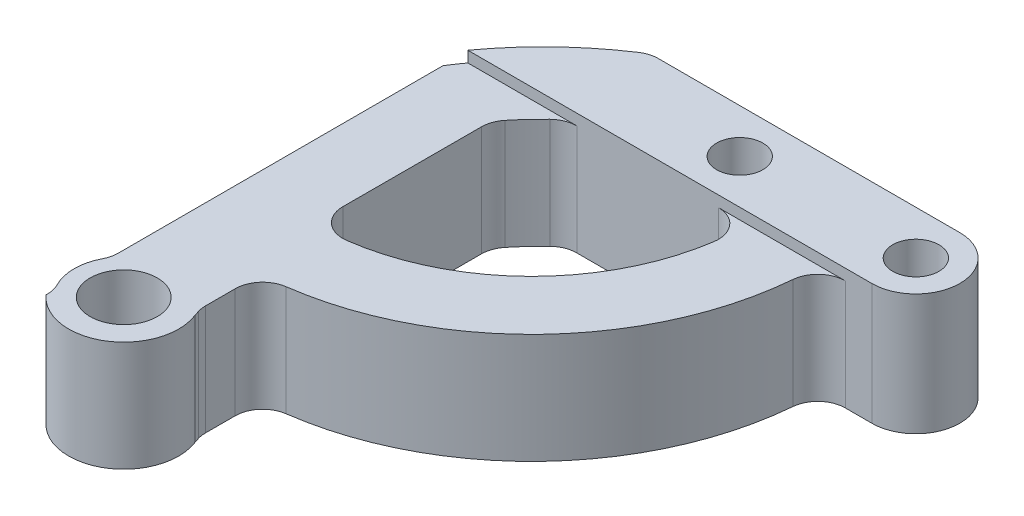
ISO-10303-21;
HEADER;
FILE_DESCRIPTION(('STEP AP214'),'2;1');
FILE_NAME('part.step','',(''),(''),'','','');
FILE_SCHEMA(('AUTOMOTIVE_DESIGN { 1 0 10303 214 1 1 1 1 }'));
ENDSEC;
DATA;
#1=APPLICATION_CONTEXT('core data for automotive mechanical design processes');
#2=APPLICATION_PROTOCOL_DEFINITION('international standard','automotive_design',2000,#1);
#3=PRODUCT_CONTEXT('',#1,'mechanical');
#4=PRODUCT('Part','Part','',(#3));
#5=PRODUCT_RELATED_PRODUCT_CATEGORY('part','',(#4));
#6=PRODUCT_DEFINITION_FORMATION('','',#4);
#7=PRODUCT_DEFINITION_CONTEXT('part definition',#1,'design');
#8=PRODUCT_DEFINITION('design','',#6,#7);
#9=PRODUCT_DEFINITION_SHAPE('','',#8);
#10=(LENGTH_UNIT() NAMED_UNIT(*) SI_UNIT(.MILLI.,.METRE.));
#11=(NAMED_UNIT(*) PLANE_ANGLE_UNIT() SI_UNIT($,.RADIAN.));
#12=(NAMED_UNIT(*) SI_UNIT($,.STERADIAN.) SOLID_ANGLE_UNIT());
#13=UNCERTAINTY_MEASURE_WITH_UNIT(LENGTH_MEASURE(1.E-05),#10,'distance_accuracy_value','');
#14=(GEOMETRIC_REPRESENTATION_CONTEXT(3) GLOBAL_UNCERTAINTY_ASSIGNED_CONTEXT((#13)) GLOBAL_UNIT_ASSIGNED_CONTEXT((#10,
#11,#12)) REPRESENTATION_CONTEXT('',''));
#15=CARTESIAN_POINT('',(0.,0.,0.));
#16=DIRECTION('',(0.,0.,1.));
#17=DIRECTION('',(1.,0.,0.));
#18=AXIS2_PLACEMENT_3D('',#15,#16,#17);
#19=CARTESIAN_POINT('',(-137.900057304547,11.,45.0701696846439));
#20=DIRECTION('',(0.,1.,0.));
#21=DIRECTION('',(0.,0.,1.));
#22=AXIS2_PLACEMENT_3D('',#19,#20,#21);
#23=PLANE('',#22);
#24=DIRECTION('',(-1.,0.,0.));
#25=VECTOR('',#24,1.);
#26=CARTESIAN_POINT('',(-115.253720533932,11.,10.999999988027));
#27=LINE('',#26,#25);
#28=CARTESIAN_POINT('',(-103.99999853308,11.,11.0000022761214));
#29=VERTEX_POINT('',#28);
#30=CARTESIAN_POINT('',(-140.702512300106,11.,11.0000022761214));
#31=VERTEX_POINT('',#30);
#32=EDGE_CURVE('E212',#29,#31,#27,.T.);
#33=ORIENTED_EDGE('',*,*,#32,.F.);
#34=CARTESIAN_POINT('',(-103.99999853308,11.,7.00000227612142));
#35=DIRECTION('',(0.,1.,0.));
#36=DIRECTION('',(0.,0.,1.));
#37=AXIS2_PLACEMENT_3D('',#34,#35,#36);
#38=CIRCLE('',#37,4.);
#39=CARTESIAN_POINT('',(-103.99999853308,11.,3.00000227612141));
#40=VERTEX_POINT('',#39);
#41=EDGE_CURVE('E246',#29,#40,#38,.T.);
#42=ORIENTED_EDGE('',*,*,#41,.T.);
#43=DIRECTION('',(-1.,0.,0.));
#44=VECTOR('',#43,1.);
#45=CARTESIAN_POINT('',(-103.99999853308,11.,3.00000227612141));
#46=LINE('',#45,#44);
#47=CARTESIAN_POINT('',(-131.402508646967,11.,3.00000227612142));
#48=VERTEX_POINT('',#47);
#49=EDGE_CURVE('E242',#40,#48,#46,.T.);
#50=ORIENTED_EDGE('',*,*,#49,.T.);
#51=CARTESIAN_POINT('',(-131.402508646967,11.,5.50000227612142));
#52=DIRECTION('',(0.,1.,0.));
#53=DIRECTION('',(0.,0.,1.));
#54=AXIS2_PLACEMENT_3D('',#51,#52,#53);
#55=CIRCLE('',#54,2.5);
#56=CARTESIAN_POINT('',(-132.779604595994,11.,3.41347244236101));
#57=VERTEX_POINT('',#56);
#58=EDGE_CURVE('E240',#48,#57,#55,.T.);
#59=ORIENTED_EDGE('',*,*,#58,.T.);
#60=CARTESIAN_POINT('',(-115.936153617783,11.,28.9341073656856));
#61=DIRECTION('',(0.,1.,0.));
#62=DIRECTION('',(0.,0.,1.));
#63=AXIS2_PLACEMENT_3D('',#60,#61,#62);
#64=CIRCLE('',#63,30.5778457015044);
#65=EDGE_CURVE('E231',#57,#31,#64,.T.);
#66=ORIENTED_EDGE('',*,*,#65,.T.);
#67=EDGE_LOOP('',(#33,#42,#50,#59,#66));
#68=FACE_BOUND('',#67,.T.);
#69=CARTESIAN_POINT('',(-120.,11.,7.));
#70=DIRECTION('',(0.,1.,0.));
#71=DIRECTION('',(0.,0.,1.));
#72=AXIS2_PLACEMENT_3D('',#69,#70,#71);
#73=CIRCLE('',#72,2.1);
#74=CARTESIAN_POINT('',(-120.,11.,9.1));
#75=VERTEX_POINT('',#74);
#76=EDGE_CURVE('E254',#75,#75,#73,.T.);
#77=ORIENTED_EDGE('',*,*,#76,.F.);
#78=EDGE_LOOP('',(#77));
#79=FACE_BOUND('',#78,.T.);
#80=CARTESIAN_POINT('',(-103.99999853308,11.,7.00000227612142));
#81=DIRECTION('',(0.,1.,0.));
#82=DIRECTION('',(0.,0.,1.));
#83=AXIS2_PLACEMENT_3D('',#80,#81,#82);
#84=CIRCLE('',#83,2.1);
#85=CARTESIAN_POINT('',(-103.99999853308,11.,9.10000227612142));
#86=VERTEX_POINT('',#85);
#87=EDGE_CURVE('E431',#86,#86,#84,.T.);
#88=ORIENTED_EDGE('',*,*,#87,.F.);
#89=EDGE_LOOP('',(#88));
#90=FACE_BOUND('',#89,.T.);
#91=ADVANCED_FACE('F33',(#68,#79,#90),#23,.T.);
#92=CARTESIAN_POINT('',(-137.900057304547,0.,45.0701696846439));
#93=DIRECTION('',(0.,1.,0.));
#94=DIRECTION('',(0.,0.,1.));
#95=AXIS2_PLACEMENT_3D('',#92,#93,#94);
#96=PLANE('',#95);
#97=CARTESIAN_POINT('',(-137.900057304547,0.,45.0701696846439));
#98=DIRECTION('',(0.,1.,0.));
#99=DIRECTION('',(0.,0.,1.));
#100=AXIS2_PLACEMENT_3D('',#97,#98,#99);
#101=CIRCLE('',#100,3.04999999999999);
#102=CARTESIAN_POINT('',(-137.900057304547,0.,48.1201696846439));
#103=VERTEX_POINT('',#102);
#104=EDGE_CURVE('E223',#103,#103,#101,.T.);
#105=ORIENTED_EDGE('',*,*,#104,.T.);
#106=EDGE_LOOP('',(#105));
#107=FACE_BOUND('',#106,.T.);
#108=CARTESIAN_POINT('',(-120.,0.,7.));
#109=DIRECTION('',(0.,1.,0.));
#110=DIRECTION('',(0.,0.,1.));
#111=AXIS2_PLACEMENT_3D('',#108,#109,#110);
#112=CIRCLE('',#111,2.1);
#113=CARTESIAN_POINT('',(-120.,0.,9.1));
#114=VERTEX_POINT('',#113);
#115=EDGE_CURVE('E449',#114,#114,#112,.T.);
#116=ORIENTED_EDGE('',*,*,#115,.T.);
#117=EDGE_LOOP('',(#116));
#118=FACE_BOUND('',#117,.T.);
#119=CARTESIAN_POINT('',(-115.936153617783,0.,28.9341073656856));
#120=DIRECTION('',(0.,1.,0.));
#121=DIRECTION('',(0.,0.,1.));
#122=AXIS2_PLACEMENT_3D('',#119,#120,#121);
#123=CIRCLE('',#122,30.5778457015044);
#124=CARTESIAN_POINT('',(-132.779604595994,0.,3.41347244236101));
#125=VERTEX_POINT('',#124);
#126=CARTESIAN_POINT('',(-141.61803314586,0.,12.3375501428647));
#127=VERTEX_POINT('',#126);
#128=EDGE_CURVE('E275',#125,#127,#123,.T.);
#129=ORIENTED_EDGE('',*,*,#128,.F.);
#130=CARTESIAN_POINT('',(-131.402508646967,0.,5.50000227612142));
#131=DIRECTION('',(0.,1.,0.));
#132=DIRECTION('',(0.,0.,1.));
#133=AXIS2_PLACEMENT_3D('',#130,#131,#132);
#134=CIRCLE('',#133,2.5);
#135=CARTESIAN_POINT('',(-131.402508646967,0.,3.00000227612142));
#136=VERTEX_POINT('',#135);
#137=EDGE_CURVE('E308',#125,#136,#134,.F.);
#138=ORIENTED_EDGE('',*,*,#137,.T.);
#139=DIRECTION('',(-1.,0.,0.));
#140=VECTOR('',#139,1.);
#141=CARTESIAN_POINT('',(-103.99999853308,0.,3.00000227612141));
#142=LINE('',#141,#140);
#143=CARTESIAN_POINT('',(-103.99999853308,0.,3.00000227612141));
#144=VERTEX_POINT('',#143);
#145=EDGE_CURVE('E273',#144,#136,#142,.T.);
#146=ORIENTED_EDGE('',*,*,#145,.F.);
#147=CARTESIAN_POINT('',(-103.99999853308,0.,7.00000227612142));
#148=DIRECTION('',(0.,1.,0.));
#149=DIRECTION('',(0.,0.,1.));
#150=AXIS2_PLACEMENT_3D('',#147,#148,#149);
#151=CIRCLE('',#150,4.);
#152=CARTESIAN_POINT('',(-103.99999853308,0.,11.0000022761214));
#153=VERTEX_POINT('',#152);
#154=EDGE_CURVE('E271',#153,#144,#151,.T.);
#155=ORIENTED_EDGE('',*,*,#154,.F.);
#156=DIRECTION('',(1.,0.,0.));
#157=VECTOR('',#156,1.);
#158=CARTESIAN_POINT('',(-103.99999853308,0.,11.0000022761214));
#159=LINE('',#158,#157);
#160=CARTESIAN_POINT('',(-106.409907587343,0.,11.0000022761214));
#161=VERTEX_POINT('',#160);
#162=EDGE_CURVE('E269',#161,#153,#159,.T.);
#163=ORIENTED_EDGE('',*,*,#162,.F.);
#164=CARTESIAN_POINT('',(-106.409907587343,0.,13.5000022761214));
#165=DIRECTION('',(0.,1.,0.));
#166=DIRECTION('',(0.,0.,1.));
#167=AXIS2_PLACEMENT_3D('',#164,#165,#166);
#168=CIRCLE('',#167,2.5);
#169=CARTESIAN_POINT('',(-108.900341189247,0.,13.2815063390666));
#170=VERTEX_POINT('',#169);
#171=EDGE_CURVE('E348',#161,#170,#168,.T.);
#172=ORIENTED_EDGE('',*,*,#171,.T.);
#173=CARTESIAN_POINT('',(-134.905127164563,0.,10.999999988027));
#174=DIRECTION('',(0.,1.,0.));
#175=DIRECTION('',(0.,0.,1.));
#176=AXIS2_PLACEMENT_3D('',#173,#174,#175);
#177=CIRCLE('',#176,26.1046770685219);
#178=CARTESIAN_POINT('',(-131.347838312971,0.,36.8611650986354));
#179=VERTEX_POINT('',#178);
#180=EDGE_CURVE('E266',#179,#170,#177,.T.);
#181=ORIENTED_EDGE('',*,*,#180,.F.);
#182=CARTESIAN_POINT('',(-131.007162881299,0.,39.3378443774794));
#183=DIRECTION('',(0.,1.,0.));
#184=DIRECTION('',(0.,0.,1.));
#185=AXIS2_PLACEMENT_3D('',#182,#183,#184);
#186=CIRCLE('',#185,2.5);
#187=CARTESIAN_POINT('',(-133.507162881299,0.,39.3378443774794));
#188=VERTEX_POINT('',#187);
#189=EDGE_CURVE('E358',#179,#188,#186,.T.);
#190=ORIENTED_EDGE('',*,*,#189,.T.);
#191=DIRECTION('',(0.,0.,-1.));
#192=VECTOR('',#191,1.);
#193=CARTESIAN_POINT('',(-133.507162881299,0.,42.4282503088));
#194=LINE('',#193,#192);
#195=CARTESIAN_POINT('',(-133.507162881299,0.,42.038769083608));
#196=VERTEX_POINT('',#195);
#197=EDGE_CURVE('E263',#196,#188,#194,.T.);
#198=ORIENTED_EDGE('',*,*,#197,.F.);
#199=CARTESIAN_POINT('',(-131.007162881299,0.,42.038769083608));
#200=DIRECTION('',(0.,1.,0.));
#201=DIRECTION('',(0.,0.,1.));
#202=AXIS2_PLACEMENT_3D('',#199,#200,#201);
#203=CIRCLE('',#202,2.5);
#204=CARTESIAN_POINT('',(-133.38760812801,0.,42.8026279890429));
#205=VERTEX_POINT('',#204);
#206=EDGE_CURVE('E346',#196,#205,#203,.T.);
#207=ORIENTED_EDGE('',*,*,#206,.T.);
#208=CARTESIAN_POINT('',(0.,0.,0.));
#209=DIRECTION('',(0.,-1.,0.));
#210=DIRECTION('',(0.,0.,1.));
#211=AXIS2_PLACEMENT_3D('',#208,#209,#210);
#212=CIRCLE('',#211,140.086826521554);
#213=CARTESIAN_POINT('',(-133.264424689396,0.,43.1846277867973));
#214=VERTEX_POINT('',#213);
#215=EDGE_CURVE('E260',#214,#205,#212,.T.);
#216=ORIENTED_EDGE('',*,*,#215,.F.);
#217=CARTESIAN_POINT('',(-130.886177783558,0.,42.413951684356));
#218=DIRECTION('',(0.,1.,0.));
#219=DIRECTION('',(0.,0.,1.));
#220=AXIS2_PLACEMENT_3D('',#217,#218,#219);
#221=CIRCLE('',#220,2.5);
#222=CARTESIAN_POINT('',(-133.224137623888,0.,43.2993576844519));
#223=VERTEX_POINT('',#222);
#224=EDGE_CURVE('E344',#214,#223,#221,.T.);
#225=ORIENTED_EDGE('',*,*,#224,.T.);
#226=CARTESIAN_POINT('',(-137.900057304547,0.,45.0701696846439));
#227=DIRECTION('',(0.,1.,0.));
#228=DIRECTION('',(0.,0.,1.));
#229=AXIS2_PLACEMENT_3D('',#226,#227,#228);
#230=CIRCLE('',#229,5.00000000000012);
#231=CARTESIAN_POINT('',(-141.61803314586,0.,48.4133202411424));
#232=VERTEX_POINT('',#231);
#233=EDGE_CURVE('E257',#232,#223,#230,.T.);
#234=ORIENTED_EDGE('',*,*,#233,.F.);
#235=DIRECTION('',(0.,0.,1.));
#236=VECTOR('',#235,1.);
#237=CARTESIAN_POINT('',(-141.61803314586,0.,48.4133202411424));
#238=LINE('',#237,#236);
#239=CARTESIAN_POINT('',(-141.61803314586,0.,48.2852554435082));
#240=VERTEX_POINT('',#239);
#241=EDGE_CURVE('E253',#240,#232,#238,.T.);
#242=ORIENTED_EDGE('',*,*,#241,.F.);
#243=CARTESIAN_POINT('',(-144.11803314586,0.,48.2852554435082));
#244=DIRECTION('',(0.,1.,0.));
#245=DIRECTION('',(0.,0.,1.));
#246=AXIS2_PLACEMENT_3D('',#243,#244,#245);
#247=CIRCLE('',#246,2.5);
#248=CARTESIAN_POINT('',(-141.897327488248,0.,47.1370105296281));
#249=VERTEX_POINT('',#248);
#250=EDGE_CURVE('E342',#240,#249,#247,.T.);
#251=ORIENTED_EDGE('',*,*,#250,.T.);
#252=CARTESIAN_POINT('',(-137.900057304547,0.,45.0701696846439));
#253=DIRECTION('',(0.,1.,0.));
#254=DIRECTION('',(0.,0.,1.));
#255=AXIS2_PLACEMENT_3D('',#252,#253,#254);
#256=CIRCLE('',#255,4.49999999999999);
#257=CARTESIAN_POINT('',(-141.897327488248,0.,43.0033288396597));
#258=VERTEX_POINT('',#257);
#259=EDGE_CURVE('E250',#258,#249,#256,.T.);
#260=ORIENTED_EDGE('',*,*,#259,.F.);
#261=CARTESIAN_POINT('',(-144.11803314586,0.,41.8550839257796));
#262=DIRECTION('',(0.,1.,0.));
#263=DIRECTION('',(0.,0.,1.));
#264=AXIS2_PLACEMENT_3D('',#261,#262,#263);
#265=CIRCLE('',#264,2.5);
#266=CARTESIAN_POINT('',(-141.61803314586,0.,41.8550839257796));
#267=VERTEX_POINT('',#266);
#268=EDGE_CURVE('E41',#258,#267,#265,.T.);
#269=ORIENTED_EDGE('',*,*,#268,.T.);
#270=DIRECTION('',(0.,0.,1.));
#271=VECTOR('',#270,1.);
#272=CARTESIAN_POINT('',(-141.61803314586,0.,42.5350847465372));
#273=LINE('',#272,#271);
#274=EDGE_CURVE('E278',#127,#267,#273,.T.);
#275=ORIENTED_EDGE('',*,*,#274,.F.);
#276=EDGE_LOOP('',(#129,#138,#146,#155,#163,#172,#181,#190,#198,#207,#216,#225,#234,#242,#251,
#260,#269,#275));
#277=FACE_BOUND('',#276,.T.);
#278=DIRECTION('',(-0.00107779575862326,0.,0.999999419177983));
#279=VECTOR('',#278,1.);
#280=CARTESIAN_POINT('',(-135.059388527963,0.,14.5432040979085));
#281=LINE('',#280,#279);
#282=CARTESIAN_POINT('',(-135.060315226767,0.,15.4030128872954));
#283=VERTEX_POINT('',#282);
#284=CARTESIAN_POINT('',(-135.073880940624,0.,27.9895404082243));
#285=VERTEX_POINT('',#284);
#286=EDGE_CURVE('E224',#283,#285,#281,.T.);
#287=ORIENTED_EDGE('',*,*,#286,.T.);
#288=CARTESIAN_POINT('',(-132.57388239268,0.,27.9922348976209));
#289=DIRECTION('',(0.,1.,0.));
#290=DIRECTION('',(0.,0.,1.));
#291=AXIS2_PLACEMENT_3D('',#288,#289,#290);
#292=CIRCLE('',#291,2.5);
#293=CARTESIAN_POINT('',(-132.234078663736,0.,30.4690339257611));
#294=VERTEX_POINT('',#293);
#295=EDGE_CURVE('E352',#285,#294,#292,.T.);
#296=ORIENTED_EDGE('',*,*,#295,.T.);
#297=CARTESIAN_POINT('',(-134.905127164563,0.,10.999999988027));
#298=DIRECTION('',(0.,1.,0.));
#299=DIRECTION('',(0.,0.,1.));
#300=AXIS2_PLACEMENT_3D('',#297,#298,#299);
#301=CIRCLE('',#300,19.6514066306311);
#302=CARTESIAN_POINT('',(-115.463599805775,0.,13.8644015869511));
#303=VERTEX_POINT('',#302);
#304=EDGE_CURVE('E434',#294,#303,#301,.T.);
#305=ORIENTED_EDGE('',*,*,#304,.T.);
#306=CARTESIAN_POINT('',(-117.93689951966,0.,13.499999988027));
#307=DIRECTION('',(0.,1.,0.));
#308=DIRECTION('',(0.,0.,1.));
#309=AXIS2_PLACEMENT_3D('',#306,#307,#308);
#310=CIRCLE('',#309,2.5);
#311=CARTESIAN_POINT('',(-117.93689951966,0.,10.999999988027));
#312=VERTEX_POINT('',#311);
#313=EDGE_CURVE('E354',#303,#312,#310,.T.);
#314=ORIENTED_EDGE('',*,*,#313,.T.);
#315=DIRECTION('',(-1.,0.,0.));
#316=VECTOR('',#315,1.);
#317=CARTESIAN_POINT('',(-115.253720533932,0.,10.999999988027));
#318=LINE('',#317,#316);
#319=CARTESIAN_POINT('',(-130.807896393838,0.,10.999999988027));
#320=VERTEX_POINT('',#319);
#321=EDGE_CURVE('E439',#312,#320,#318,.T.);
#322=ORIENTED_EDGE('',*,*,#321,.T.);
#323=CARTESIAN_POINT('',(-130.807896393838,0.,13.499999988027));
#324=DIRECTION('',(0.,1.,0.));
#325=DIRECTION('',(0.,0.,1.));
#326=AXIS2_PLACEMENT_3D('',#323,#324,#325);
#327=CIRCLE('',#326,2.5);
#328=CARTESIAN_POINT('',(-132.542561495374,0.,11.6997397330887));
#329=VERTEX_POINT('',#328);
#330=EDGE_CURVE('E356',#320,#329,#327,.T.);
#331=ORIENTED_EDGE('',*,*,#330,.T.);
#332=CARTESIAN_POINT('',(-115.936153617783,0.,28.9341073656856));
#333=DIRECTION('',(0.,1.,0.));
#334=DIRECTION('',(0.,0.,1.));
#335=AXIS2_PLACEMENT_3D('',#332,#333,#334);
#336=CIRCLE('',#335,23.9331613100406);
#337=CARTESIAN_POINT('',(-134.499387031133,0.,13.8277320382318));
#338=VERTEX_POINT('',#337);
#339=EDGE_CURVE('E442',#329,#338,#336,.T.);
#340=ORIENTED_EDGE('',*,*,#339,.T.);
#341=CARTESIAN_POINT('',(-132.560316678822,0.,15.405707376692));
#342=DIRECTION('',(0.,1.,0.));
#343=DIRECTION('',(0.,0.,1.));
#344=AXIS2_PLACEMENT_3D('',#341,#342,#343);
#345=CIRCLE('',#344,2.5);
#346=EDGE_CURVE('E350',#338,#283,#345,.T.);
#347=ORIENTED_EDGE('',*,*,#346,.T.);
#348=EDGE_LOOP('',(#287,#296,#305,#314,#322,#331,#340,#347));
#349=FACE_BOUND('',#348,.T.);
#350=CARTESIAN_POINT('',(-103.99999853308,0.,7.00000227612142));
#351=DIRECTION('',(0.,1.,0.));
#352=DIRECTION('',(0.,0.,1.));
#353=AXIS2_PLACEMENT_3D('',#350,#351,#352);
#354=CIRCLE('',#353,2.1);
#355=CARTESIAN_POINT('',(-103.99999853308,0.,9.10000227612142));
#356=VERTEX_POINT('',#355);
#357=EDGE_CURVE('E235',#356,#356,#354,.T.);
#358=ORIENTED_EDGE('',*,*,#357,.T.);
#359=EDGE_LOOP('',(#358));
#360=FACE_BOUND('',#359,.T.);
#361=ADVANCED_FACE('F364',(#107,#118,#277,#349,#360),#96,.F.);
#362=CARTESIAN_POINT('',(-137.900057304547,11.,45.0701696846439));
#363=DIRECTION('',(0.,-1.,0.));
#364=DIRECTION('',(0.,0.,-1.));
#365=AXIS2_PLACEMENT_3D('',#362,#363,#364);
#366=CYLINDRICAL_SURFACE('',#365,4.49999999999999);
#367=DIRECTION('',(0.,-1.,0.));
#368=VECTOR('',#367,1.);
#369=CARTESIAN_POINT('',(-141.897327488248,11.,47.1370105296281));
#370=LINE('',#369,#368);
#371=CARTESIAN_POINT('',(-141.897327488248,10.,47.1370105296281));
#372=VERTEX_POINT('',#371);
#373=EDGE_CURVE('E290',#249,#372,#370,.F.);
#374=ORIENTED_EDGE('',*,*,#373,.T.);
#375=CARTESIAN_POINT('',(-137.900057304547,10.,45.0701696846439));
#376=DIRECTION('',(0.,-1.,0.));
#377=DIRECTION('',(0.,0.,-1.));
#378=AXIS2_PLACEMENT_3D('',#375,#376,#377);
#379=CIRCLE('',#378,4.49999999999999);
#380=CARTESIAN_POINT('',(-141.897327488248,10.,43.0033288396597));
#381=VERTEX_POINT('',#380);
#382=EDGE_CURVE('E373',#372,#381,#379,.T.);
#383=ORIENTED_EDGE('',*,*,#382,.T.);
#384=DIRECTION('',(0.,-1.,0.));
#385=VECTOR('',#384,1.);
#386=CARTESIAN_POINT('',(-141.897327488248,11.,43.0033288396597));
#387=LINE('',#386,#385);
#388=EDGE_CURVE('E288',#381,#258,#387,.T.);
#389=ORIENTED_EDGE('',*,*,#388,.T.);
#390=ORIENTED_EDGE('',*,*,#259,.T.);
#391=EDGE_LOOP('',(#374,#383,#389,#390));
#392=FACE_BOUND('',#391,.T.);
#393=ADVANCED_FACE('F376',(#392),#366,.T.);
#394=CARTESIAN_POINT('',(-141.61803314586,11.,48.4133202411424));
#395=DIRECTION('',(1.,0.,0.));
#396=DIRECTION('',(0.,0.,-1.));
#397=AXIS2_PLACEMENT_3D('',#394,#395,#396);
#398=PLANE('',#397);
#399=DIRECTION('',(0.,-1.,0.));
#400=VECTOR('',#399,1.);
#401=CARTESIAN_POINT('',(-141.61803314586,11.,48.4133202411424));
#402=LINE('',#401,#400);
#403=CARTESIAN_POINT('',(-141.61803314586,10.,48.4133202411424));
#404=VERTEX_POINT('',#403);
#405=EDGE_CURVE('E284',#404,#232,#402,.T.);
#406=ORIENTED_EDGE('',*,*,#405,.F.);
#407=DIRECTION('',(0.,0.,-1.));
#408=VECTOR('',#407,1.);
#409=CARTESIAN_POINT('',(-141.61803314586,10.,48.4133202411424));
#410=LINE('',#409,#408);
#411=CARTESIAN_POINT('',(-141.61803314586,10.,48.2852554435082));
#412=VERTEX_POINT('',#411);
#413=EDGE_CURVE('E380',#404,#412,#410,.T.);
#414=ORIENTED_EDGE('',*,*,#413,.T.);
#415=DIRECTION('',(0.,1.,0.));
#416=VECTOR('',#415,1.);
#417=CARTESIAN_POINT('',(-141.61803314586,0.,48.2852554435082));
#418=LINE('',#417,#416);
#419=EDGE_CURVE('E286',#412,#240,#418,.F.);
#420=ORIENTED_EDGE('',*,*,#419,.T.);
#421=ORIENTED_EDGE('',*,*,#241,.T.);
#422=EDGE_LOOP('',(#406,#414,#420,#421));
#423=FACE_BOUND('',#422,.T.);
#424=ADVANCED_FACE('F612',(#423),#398,.F.);
#425=CARTESIAN_POINT('',(-137.900057304547,11.,45.0701696846439));
#426=DIRECTION('',(0.,-1.,0.));
#427=DIRECTION('',(0.,0.,-1.));
#428=AXIS2_PLACEMENT_3D('',#425,#426,#427);
#429=CYLINDRICAL_SURFACE('',#428,5.00000000000012);
#430=DIRECTION('',(0.,-1.,0.));
#431=VECTOR('',#430,1.);
#432=CARTESIAN_POINT('',(-133.224137623888,11.,43.2993576844519));
#433=LINE('',#432,#431);
#434=CARTESIAN_POINT('',(-133.224137623888,10.,43.2993576844519));
#435=VERTEX_POINT('',#434);
#436=EDGE_CURVE('E298',#223,#435,#433,.F.);
#437=ORIENTED_EDGE('',*,*,#436,.T.);
#438=CARTESIAN_POINT('',(-137.900057304547,10.,45.0701696846439));
#439=DIRECTION('',(0.,-1.,0.));
#440=DIRECTION('',(0.,0.,-1.));
#441=AXIS2_PLACEMENT_3D('',#438,#439,#440);
#442=CIRCLE('',#441,5.00000000000012);
#443=EDGE_CURVE('E387',#435,#404,#442,.T.);
#444=ORIENTED_EDGE('',*,*,#443,.T.);
#445=ORIENTED_EDGE('',*,*,#405,.T.);
#446=ORIENTED_EDGE('',*,*,#233,.T.);
#447=EDGE_LOOP('',(#437,#444,#445,#446));
#448=FACE_BOUND('',#447,.T.);
#449=ADVANCED_FACE('F609',(#448),#429,.T.);
#450=CARTESIAN_POINT('',(0.,11.,0.));
#451=DIRECTION('',(0.,-1.,0.));
#452=DIRECTION('',(0.,0.,-1.));
#453=AXIS2_PLACEMENT_3D('',#450,#451,#452);
#454=CYLINDRICAL_SURFACE('',#453,140.086826521554);
#455=DIRECTION('',(0.,-1.,0.));
#456=VECTOR('',#455,1.);
#457=CARTESIAN_POINT('',(-133.38760812801,11.,42.8026279890429));
#458=LINE('',#457,#456);
#459=CARTESIAN_POINT('',(-133.38760812801,10.,42.8026279890429));
#460=VERTEX_POINT('',#459);
#461=EDGE_CURVE('E293',#205,#460,#458,.F.);
#462=ORIENTED_EDGE('',*,*,#461,.T.);
#463=CARTESIAN_POINT('',(0.,10.,0.));
#464=DIRECTION('',(0.,-1.,0.));
#465=DIRECTION('',(0.,0.,-1.));
#466=AXIS2_PLACEMENT_3D('',#463,#464,#465);
#467=CIRCLE('',#466,140.086826521554);
#468=CARTESIAN_POINT('',(-133.264424689396,10.,43.1846277867973));
#469=VERTEX_POINT('',#468);
#470=EDGE_CURVE('E393',#460,#469,#467,.F.);
#471=ORIENTED_EDGE('',*,*,#470,.T.);
#472=DIRECTION('',(0.,-1.,0.));
#473=VECTOR('',#472,1.);
#474=CARTESIAN_POINT('',(-133.264424689396,11.,43.1846277867973));
#475=LINE('',#474,#473);
#476=EDGE_CURVE('E296',#469,#214,#475,.T.);
#477=ORIENTED_EDGE('',*,*,#476,.T.);
#478=ORIENTED_EDGE('',*,*,#215,.T.);
#479=EDGE_LOOP('',(#462,#471,#477,#478));
#480=FACE_BOUND('',#479,.T.);
#481=ADVANCED_FACE('F601',(#480),#454,.F.);
#482=CARTESIAN_POINT('',(-133.507162881299,11.,42.4282503088));
#483=DIRECTION('',(-1.,0.,0.));
#484=DIRECTION('',(0.,0.,1.));
#485=AXIS2_PLACEMENT_3D('',#482,#483,#484);
#486=PLANE('',#485);
#487=DIRECTION('',(0.,1.,0.));
#488=VECTOR('',#487,1.);
#489=CARTESIAN_POINT('',(-133.507162881299,11.,39.3378443774794));
#490=LINE('',#489,#488);
#491=CARTESIAN_POINT('',(-133.507162881299,10.,39.3378443774794));
#492=VERTEX_POINT('',#491);
#493=EDGE_CURVE('E301',#188,#492,#490,.T.);
#494=ORIENTED_EDGE('',*,*,#493,.T.);
#495=DIRECTION('',(0.,0.,1.));
#496=VECTOR('',#495,1.);
#497=CARTESIAN_POINT('',(-133.507162881299,10.,42.4282503088));
#498=LINE('',#497,#496);
#499=CARTESIAN_POINT('',(-133.507162881299,10.,42.038769083608));
#500=VERTEX_POINT('',#499);
#501=EDGE_CURVE('E399',#492,#500,#498,.T.);
#502=ORIENTED_EDGE('',*,*,#501,.T.);
#503=DIRECTION('',(0.,1.,0.));
#504=VECTOR('',#503,1.);
#505=CARTESIAN_POINT('',(-133.507162881299,0.,42.038769083608));
#506=LINE('',#505,#504);
#507=EDGE_CURVE('E304',#500,#196,#506,.F.);
#508=ORIENTED_EDGE('',*,*,#507,.T.);
#509=ORIENTED_EDGE('',*,*,#197,.T.);
#510=EDGE_LOOP('',(#494,#502,#508,#509));
#511=FACE_BOUND('',#510,.T.);
#512=ADVANCED_FACE('F595',(#511),#486,.F.);
#513=CARTESIAN_POINT('',(-134.905127164563,11.,10.999999988027));
#514=DIRECTION('',(0.,-1.,0.));
#515=DIRECTION('',(0.,0.,-1.));
#516=AXIS2_PLACEMENT_3D('',#513,#514,#515);
#517=CYLINDRICAL_SURFACE('',#516,26.1046770685219);
#518=DIRECTION('',(0.,-1.,0.));
#519=VECTOR('',#518,1.);
#520=CARTESIAN_POINT('',(-108.900341189247,11.,13.2815063390666));
#521=LINE('',#520,#519);
#522=CARTESIAN_POINT('',(-108.900341189247,10.,13.2815063390666));
#523=VERTEX_POINT('',#522);
#524=EDGE_CURVE('E316',#170,#523,#521,.F.);
#525=ORIENTED_EDGE('',*,*,#524,.T.);
#526=CARTESIAN_POINT('',(-134.905127164563,10.,10.999999988027));
#527=DIRECTION('',(0.,-1.,0.));
#528=DIRECTION('',(0.,0.,-1.));
#529=AXIS2_PLACEMENT_3D('',#526,#527,#528);
#530=CIRCLE('',#529,26.1046770685219);
#531=CARTESIAN_POINT('',(-131.347838312971,10.,36.8611650986354));
#532=VERTEX_POINT('',#531);
#533=EDGE_CURVE('E405',#523,#532,#530,.T.);
#534=ORIENTED_EDGE('',*,*,#533,.T.);
#535=DIRECTION('',(0.,-1.,0.));
#536=VECTOR('',#535,1.);
#537=CARTESIAN_POINT('',(-131.347838312971,11.,36.8611650986354));
#538=LINE('',#537,#536);
#539=EDGE_CURVE('E314',#532,#179,#538,.T.);
#540=ORIENTED_EDGE('',*,*,#539,.T.);
#541=ORIENTED_EDGE('',*,*,#180,.T.);
#542=EDGE_LOOP('',(#525,#534,#540,#541));
#543=FACE_BOUND('',#542,.T.);
#544=ADVANCED_FACE('F587',(#543),#517,.T.);
#545=CARTESIAN_POINT('',(-103.99999853308,11.,11.0000022761214));
#546=DIRECTION('',(0.,0.,-1.));
#547=DIRECTION('',(-1.,0.,0.));
#548=AXIS2_PLACEMENT_3D('',#545,#546,#547);
#549=PLANE('',#548);
#550=ORIENTED_EDGE('',*,*,#162,.T.);
#551=DIRECTION('',(0.,-1.,0.));
#552=VECTOR('',#551,1.);
#553=CARTESIAN_POINT('',(-103.99999853308,11.,11.0000022761214));
#554=LINE('',#553,#552);
#555=EDGE_CURVE('E219',#29,#153,#554,.T.);
#556=ORIENTED_EDGE('',*,*,#555,.F.);
#557=ORIENTED_EDGE('',*,*,#32,.T.);
#558=DIRECTION('',(0.,-1.,0.));
#559=VECTOR('',#558,1.);
#560=CARTESIAN_POINT('',(-140.702512300106,11.,11.0000022761214));
#561=LINE('',#560,#559);
#562=CARTESIAN_POINT('',(-140.702512300106,10.,11.0000022761214));
#563=VERTEX_POINT('',#562);
#564=EDGE_CURVE('E217',#563,#31,#561,.F.);
#565=ORIENTED_EDGE('',*,*,#564,.F.);
#566=DIRECTION('',(-1.,0.,0.));
#567=VECTOR('',#566,1.);
#568=CARTESIAN_POINT('',(-101.79996566444,10.,11.0000022761214));
#569=LINE('',#568,#567);
#570=CARTESIAN_POINT('',(-130.807896393838,10.,11.0000022761214));
#571=VERTEX_POINT('',#570);
#572=EDGE_CURVE('E550',#571,#563,#569,.T.);
#573=ORIENTED_EDGE('',*,*,#572,.F.);
#574=DIRECTION('',(0.,1.,0.));
#575=VECTOR('',#574,1.);
#576=CARTESIAN_POINT('',(-130.807896393838,0.,10.999999988027));
#577=LINE('',#576,#575);
#578=EDGE_CURVE('E334',#571,#320,#577,.F.);
#579=ORIENTED_EDGE('',*,*,#578,.T.);
#580=ORIENTED_EDGE('',*,*,#321,.F.);
#581=DIRECTION('',(0.,1.,0.));
#582=VECTOR('',#581,1.);
#583=CARTESIAN_POINT('',(-117.93689951966,11.,10.999999988027));
#584=LINE('',#583,#582);
#585=CARTESIAN_POINT('',(-117.93689951966,10.,11.0000022761214));
#586=VERTEX_POINT('',#585);
#587=EDGE_CURVE('E336',#312,#586,#584,.T.);
#588=ORIENTED_EDGE('',*,*,#587,.T.);
#589=CARTESIAN_POINT('',(-106.409907587343,10.,11.0000022761214));
#590=VERTEX_POINT('',#589);
#591=EDGE_CURVE('E551',#590,#586,#569,.T.);
#592=ORIENTED_EDGE('',*,*,#591,.F.);
#593=DIRECTION('',(0.,1.,0.));
#594=VECTOR('',#593,1.);
#595=CARTESIAN_POINT('',(-106.409907587343,0.,11.0000022761214));
#596=LINE('',#595,#594);
#597=EDGE_CURVE('E312',#590,#161,#596,.F.);
#598=ORIENTED_EDGE('',*,*,#597,.T.);
#599=EDGE_LOOP('',(#550,#556,#557,#565,#573,#579,#580,#588,#592,#598));
#600=FACE_BOUND('',#599,.T.);
#601=ADVANCED_FACE('F215',(#600),#549,.F.);
#602=CARTESIAN_POINT('',(-103.99999853308,11.,7.00000227612142));
#603=DIRECTION('',(0.,-1.,0.));
#604=DIRECTION('',(0.,0.,-1.));
#605=AXIS2_PLACEMENT_3D('',#602,#603,#604);
#606=CYLINDRICAL_SURFACE('',#605,4.);
#607=ORIENTED_EDGE('',*,*,#154,.T.);
#608=DIRECTION('',(0.,-1.,0.));
#609=VECTOR('',#608,1.);
#610=CARTESIAN_POINT('',(-103.99999853308,11.,3.00000227612141));
#611=LINE('',#610,#609);
#612=EDGE_CURVE('E244',#40,#144,#611,.T.);
#613=ORIENTED_EDGE('',*,*,#612,.F.);
#614=ORIENTED_EDGE('',*,*,#41,.F.);
#615=ORIENTED_EDGE('',*,*,#555,.T.);
#616=EDGE_LOOP('',(#607,#613,#614,#615));
#617=FACE_BOUND('',#616,.T.);
#618=ADVANCED_FACE('F455',(#617),#606,.T.);
#619=CARTESIAN_POINT('',(-103.99999853308,11.,3.00000227612141));
#620=DIRECTION('',(0.,0.,1.));
#621=DIRECTION('',(1.,0.,0.));
#622=AXIS2_PLACEMENT_3D('',#619,#620,#621);
#623=PLANE('',#622);
#624=ORIENTED_EDGE('',*,*,#145,.T.);
#625=DIRECTION('',(0.,-1.,0.));
#626=VECTOR('',#625,1.);
#627=CARTESIAN_POINT('',(-131.402508646967,11.,3.00000227612142));
#628=LINE('',#627,#626);
#629=EDGE_CURVE('E55',#136,#48,#628,.F.);
#630=ORIENTED_EDGE('',*,*,#629,.T.);
#631=ORIENTED_EDGE('',*,*,#49,.F.);
#632=ORIENTED_EDGE('',*,*,#612,.T.);
#633=EDGE_LOOP('',(#624,#630,#631,#632));
#634=FACE_BOUND('',#633,.T.);
#635=ADVANCED_FACE('F458',(#634),#623,.F.);
#636=CARTESIAN_POINT('',(-115.936153617783,11.,28.9341073656856));
#637=DIRECTION('',(0.,-1.,0.));
#638=DIRECTION('',(0.,0.,-1.));
#639=AXIS2_PLACEMENT_3D('',#636,#637,#638);
#640=CYLINDRICAL_SURFACE('',#639,30.5778457015044);
#641=CARTESIAN_POINT('',(-115.936153617783,10.,28.9341073656856));
#642=DIRECTION('',(0.,-1.,0.));
#643=DIRECTION('',(0.,0.,-1.));
#644=AXIS2_PLACEMENT_3D('',#641,#642,#643);
#645=CIRCLE('',#644,30.5778457015044);
#646=CARTESIAN_POINT('',(-141.61803314586,10.,12.3375501428647));
#647=VERTEX_POINT('',#646);
#648=EDGE_CURVE('E234',#647,#563,#645,.T.);
#649=ORIENTED_EDGE('',*,*,#648,.T.);
#650=ORIENTED_EDGE('',*,*,#564,.T.);
#651=ORIENTED_EDGE('',*,*,#65,.F.);
#652=DIRECTION('',(0.,-1.,0.));
#653=VECTOR('',#652,1.);
#654=CARTESIAN_POINT('',(-132.779604595994,11.,3.41347244236101));
#655=LINE('',#654,#653);
#656=EDGE_CURVE('E306',#57,#125,#655,.T.);
#657=ORIENTED_EDGE('',*,*,#656,.T.);
#658=ORIENTED_EDGE('',*,*,#128,.T.);
#659=DIRECTION('',(0.,-1.,0.));
#660=VECTOR('',#659,1.);
#661=CARTESIAN_POINT('',(-141.61803314586,11.,12.3375501428647));
#662=LINE('',#661,#660);
#663=EDGE_CURVE('E241',#647,#127,#662,.T.);
#664=ORIENTED_EDGE('',*,*,#663,.F.);
#665=EDGE_LOOP('',(#649,#650,#651,#657,#658,#664));
#666=FACE_BOUND('',#665,.T.);
#667=ADVANCED_FACE('F229',(#666),#640,.T.);
#668=CARTESIAN_POINT('',(-141.61803314586,11.,42.5350847465372));
#669=DIRECTION('',(1.,0.,0.));
#670=DIRECTION('',(0.,0.,-1.));
#671=AXIS2_PLACEMENT_3D('',#668,#669,#670);
#672=PLANE('',#671);
#673=DIRECTION('',(0.,1.,0.));
#674=VECTOR('',#673,1.);
#675=CARTESIAN_POINT('',(-141.61803314586,11.,41.8550839257796));
#676=LINE('',#675,#674);
#677=CARTESIAN_POINT('',(-141.61803314586,10.,41.8550839257796));
#678=VERTEX_POINT('',#677);
#679=EDGE_CURVE('E339',#267,#678,#676,.T.);
#680=ORIENTED_EDGE('',*,*,#679,.T.);
#681=DIRECTION('',(0.,0.,-1.));
#682=VECTOR('',#681,1.);
#683=CARTESIAN_POINT('',(-141.61803314586,10.,42.5350847465372));
#684=LINE('',#683,#682);
#685=EDGE_CURVE('E48',#678,#647,#684,.T.);
#686=ORIENTED_EDGE('',*,*,#685,.T.);
#687=ORIENTED_EDGE('',*,*,#663,.T.);
#688=ORIENTED_EDGE('',*,*,#274,.T.);
#689=EDGE_LOOP('',(#680,#686,#687,#688));
#690=FACE_BOUND('',#689,.T.);
#691=ADVANCED_FACE('F370',(#690),#672,.F.);
#692=CARTESIAN_POINT('',(-120.,11.,7.));
#693=DIRECTION('',(0.,-1.,0.));
#694=DIRECTION('',(0.,0.,-1.));
#695=AXIS2_PLACEMENT_3D('',#692,#693,#694);
#696=CYLINDRICAL_SURFACE('',#695,2.1);
#697=ORIENTED_EDGE('',*,*,#76,.T.);
#698=EDGE_LOOP('',(#697));
#699=FACE_BOUND('',#698,.T.);
#700=ORIENTED_EDGE('',*,*,#115,.F.);
#701=EDGE_LOOP('',(#700));
#702=FACE_BOUND('',#701,.T.);
#703=ADVANCED_FACE('F475',(#699,#702),#696,.F.);
#704=CARTESIAN_POINT('',(-137.900057304547,11.,45.0701696846439));
#705=DIRECTION('',(0.,-1.,0.));
#706=DIRECTION('',(0.,0.,-1.));
#707=AXIS2_PLACEMENT_3D('',#704,#705,#706);
#708=CYLINDRICAL_SURFACE('',#707,3.04999999999999);
#709=CARTESIAN_POINT('',(-137.900057304547,10.,45.0701696846439));
#710=DIRECTION('',(0.,-1.,0.));
#711=DIRECTION('',(0.,0.,-1.));
#712=AXIS2_PLACEMENT_3D('',#709,#710,#711);
#713=CIRCLE('',#712,3.04999999999999);
#714=CARTESIAN_POINT('',(-137.900057304547,10.,42.0201696846439));
#715=VERTEX_POINT('',#714);
#716=EDGE_CURVE('E236',#715,#715,#713,.T.);
#717=ORIENTED_EDGE('',*,*,#716,.F.);
#718=EDGE_LOOP('',(#717));
#719=FACE_BOUND('',#718,.T.);
#720=ORIENTED_EDGE('',*,*,#104,.F.);
#721=EDGE_LOOP('',(#720));
#722=FACE_BOUND('',#721,.T.);
#723=ADVANCED_FACE('F482',(#719,#722),#708,.F.);
#724=CARTESIAN_POINT('',(-134.905127164563,11.,10.999999988027));
#725=DIRECTION('',(0.,-1.,0.));
#726=DIRECTION('',(0.,0.,-1.));
#727=AXIS2_PLACEMENT_3D('',#724,#725,#726);
#728=CYLINDRICAL_SURFACE('',#727,19.6514066306311);
#729=CARTESIAN_POINT('',(-134.905127164563,10.,10.999999988027));
#730=DIRECTION('',(0.,-1.,0.));
#731=DIRECTION('',(0.,0.,-1.));
#732=AXIS2_PLACEMENT_3D('',#729,#730,#731);
#733=CIRCLE('',#732,19.6514066306311);
#734=CARTESIAN_POINT('',(-115.463599805775,10.,13.8644015869511));
#735=VERTEX_POINT('',#734);
#736=CARTESIAN_POINT('',(-132.234078663736,10.,30.4690339257611));
#737=VERTEX_POINT('',#736);
#738=EDGE_CURVE('E424',#735,#737,#733,.T.);
#739=ORIENTED_EDGE('',*,*,#738,.F.);
#740=DIRECTION('',(0.,-1.,0.));
#741=VECTOR('',#740,1.);
#742=CARTESIAN_POINT('',(-115.463599805775,11.,13.8644015869511));
#743=LINE('',#742,#741);
#744=EDGE_CURVE('E329',#735,#303,#743,.T.);
#745=ORIENTED_EDGE('',*,*,#744,.T.);
#746=ORIENTED_EDGE('',*,*,#304,.F.);
#747=DIRECTION('',(0.,-1.,0.));
#748=VECTOR('',#747,1.);
#749=CARTESIAN_POINT('',(-132.234078663736,11.,30.4690339257611));
#750=LINE('',#749,#748);
#751=EDGE_CURVE('E331',#294,#737,#750,.F.);
#752=ORIENTED_EDGE('',*,*,#751,.T.);
#753=EDGE_LOOP('',(#739,#745,#746,#752));
#754=FACE_BOUND('',#753,.T.);
#755=ADVANCED_FACE('F487',(#754),#728,.F.);
#756=CARTESIAN_POINT('',(-115.936153617783,11.,28.9341073656856));
#757=DIRECTION('',(0.,-1.,0.));
#758=DIRECTION('',(0.,0.,-1.));
#759=AXIS2_PLACEMENT_3D('',#756,#757,#758);
#760=CYLINDRICAL_SURFACE('',#759,23.9331613100406);
#761=CARTESIAN_POINT('',(-115.936153617783,10.,28.9341073656856));
#762=DIRECTION('',(0.,-1.,0.));
#763=DIRECTION('',(0.,0.,-1.));
#764=AXIS2_PLACEMENT_3D('',#761,#762,#763);
#765=CIRCLE('',#764,23.9331613100406);
#766=CARTESIAN_POINT('',(-134.499387031133,10.,13.8277320382318));
#767=VERTEX_POINT('',#766);
#768=CARTESIAN_POINT('',(-132.542561495374,10.,11.6997397330887));
#769=VERTEX_POINT('',#768);
#770=EDGE_CURVE('E414',#767,#769,#765,.T.);
#771=ORIENTED_EDGE('',*,*,#770,.F.);
#772=DIRECTION('',(0.,-1.,0.));
#773=VECTOR('',#772,1.);
#774=CARTESIAN_POINT('',(-134.499387031133,11.,13.8277320382318));
#775=LINE('',#774,#773);
#776=EDGE_CURVE('E322',#767,#338,#775,.T.);
#777=ORIENTED_EDGE('',*,*,#776,.T.);
#778=ORIENTED_EDGE('',*,*,#339,.F.);
#779=DIRECTION('',(0.,-1.,0.));
#780=VECTOR('',#779,1.);
#781=CARTESIAN_POINT('',(-132.542561495374,11.,11.6997397330887));
#782=LINE('',#781,#780);
#783=EDGE_CURVE('E319',#329,#769,#782,.F.);
#784=ORIENTED_EDGE('',*,*,#783,.T.);
#785=EDGE_LOOP('',(#771,#777,#778,#784));
#786=FACE_BOUND('',#785,.T.);
#787=ADVANCED_FACE('F511',(#786),#760,.F.);
#788=CARTESIAN_POINT('',(-135.059388527963,11.,14.5432040979085));
#789=DIRECTION('',(0.999999419177983,0.,0.00107779575862326));
#790=DIRECTION('',(0.00107779575862326,0.,-0.999999419177983));
#791=AXIS2_PLACEMENT_3D('',#788,#789,#790);
#792=PLANE('',#791);
#793=DIRECTION('',(0.00107779575862326,0.,-0.999999419177983));
#794=VECTOR('',#793,1.);
#795=CARTESIAN_POINT('',(-135.059388527963,10.,14.5432040979085));
#796=LINE('',#795,#794);
#797=CARTESIAN_POINT('',(-135.073880940624,10.,27.9895404082244));
#798=VERTEX_POINT('',#797);
#799=CARTESIAN_POINT('',(-135.060315226767,10.,15.4030128872954));
#800=VERTEX_POINT('',#799);
#801=EDGE_CURVE('E419',#798,#800,#796,.T.);
#802=ORIENTED_EDGE('',*,*,#801,.F.);
#803=DIRECTION('',(0.,1.,0.));
#804=VECTOR('',#803,1.);
#805=CARTESIAN_POINT('',(-135.073880940624,0.,27.9895404082243));
#806=LINE('',#805,#804);
#807=EDGE_CURVE('E324',#798,#285,#806,.F.);
#808=ORIENTED_EDGE('',*,*,#807,.T.);
#809=ORIENTED_EDGE('',*,*,#286,.F.);
#810=DIRECTION('',(0.,1.,0.));
#811=VECTOR('',#810,1.);
#812=CARTESIAN_POINT('',(-135.060315226767,11.,15.4030128872954));
#813=LINE('',#812,#811);
#814=EDGE_CURVE('E326',#283,#800,#813,.T.);
#815=ORIENTED_EDGE('',*,*,#814,.T.);
#816=EDGE_LOOP('',(#802,#808,#809,#815));
#817=FACE_BOUND('',#816,.T.);
#818=ADVANCED_FACE('F500',(#817),#792,.T.);
#819=CARTESIAN_POINT('',(-103.99999853308,11.,7.00000227612142));
#820=DIRECTION('',(0.,-1.,0.));
#821=DIRECTION('',(0.,0.,-1.));
#822=AXIS2_PLACEMENT_3D('',#819,#820,#821);
#823=CYLINDRICAL_SURFACE('',#822,2.1);
#824=ORIENTED_EDGE('',*,*,#87,.T.);
#825=EDGE_LOOP('',(#824));
#826=FACE_BOUND('',#825,.T.);
#827=ORIENTED_EDGE('',*,*,#357,.F.);
#828=EDGE_LOOP('',(#827));
#829=FACE_BOUND('',#828,.T.);
#830=ADVANCED_FACE('F496',(#826,#829),#823,.F.);
#831=CARTESIAN_POINT('',(-144.11803314586,11.,48.2852554435082));
#832=DIRECTION('',(0.,-1.,0.));
#833=DIRECTION('',(0.,0.,-1.));
#834=AXIS2_PLACEMENT_3D('',#831,#832,#833);
#835=CYLINDRICAL_SURFACE('',#834,2.5);
#836=ORIENTED_EDGE('',*,*,#419,.F.);
#837=CARTESIAN_POINT('',(-144.11803314586,10.,48.2852554435082));
#838=DIRECTION('',(0.,-1.,0.));
#839=DIRECTION('',(0.,0.,-1.));
#840=AXIS2_PLACEMENT_3D('',#837,#838,#839);
#841=CIRCLE('',#840,2.5);
#842=EDGE_CURVE('E378',#412,#372,#841,.F.);
#843=ORIENTED_EDGE('',*,*,#842,.T.);
#844=ORIENTED_EDGE('',*,*,#373,.F.);
#845=ORIENTED_EDGE('',*,*,#250,.F.);
#846=EDGE_LOOP('',(#836,#843,#844,#845));
#847=FACE_BOUND('',#846,.T.);
#848=ADVANCED_FACE('F499',(#847),#835,.F.);
#849=CARTESIAN_POINT('',(-130.886177783558,11.,42.413951684356));
#850=DIRECTION('',(0.,-1.,0.));
#851=DIRECTION('',(0.,0.,-1.));
#852=AXIS2_PLACEMENT_3D('',#849,#850,#851);
#853=CYLINDRICAL_SURFACE('',#852,2.5);
#854=ORIENTED_EDGE('',*,*,#476,.F.);
#855=CARTESIAN_POINT('',(-130.886177783558,10.,42.413951684356));
#856=DIRECTION('',(0.,-1.,0.));
#857=DIRECTION('',(0.,0.,-1.));
#858=AXIS2_PLACEMENT_3D('',#855,#856,#857);
#859=CIRCLE('',#858,2.5);
#860=EDGE_CURVE('E390',#469,#435,#859,.F.);
#861=ORIENTED_EDGE('',*,*,#860,.T.);
#862=ORIENTED_EDGE('',*,*,#436,.F.);
#863=ORIENTED_EDGE('',*,*,#224,.F.);
#864=EDGE_LOOP('',(#854,#861,#862,#863));
#865=FACE_BOUND('',#864,.T.);
#866=ADVANCED_FACE('F508',(#865),#853,.F.);
#867=CARTESIAN_POINT('',(-131.007162881299,11.,42.038769083608));
#868=DIRECTION('',(0.,-1.,0.));
#869=DIRECTION('',(0.,0.,-1.));
#870=AXIS2_PLACEMENT_3D('',#867,#868,#869);
#871=CYLINDRICAL_SURFACE('',#870,2.5);
#872=ORIENTED_EDGE('',*,*,#507,.F.);
#873=CARTESIAN_POINT('',(-131.007162881299,10.,42.038769083608));
#874=DIRECTION('',(0.,-1.,0.));
#875=DIRECTION('',(0.,0.,-1.));
#876=AXIS2_PLACEMENT_3D('',#873,#874,#875);
#877=CIRCLE('',#876,2.5);
#878=EDGE_CURVE('E396',#500,#460,#877,.F.);
#879=ORIENTED_EDGE('',*,*,#878,.T.);
#880=ORIENTED_EDGE('',*,*,#461,.F.);
#881=ORIENTED_EDGE('',*,*,#206,.F.);
#882=EDGE_LOOP('',(#872,#879,#880,#881));
#883=FACE_BOUND('',#882,.T.);
#884=ADVANCED_FACE('F557',(#883),#871,.F.);
#885=CARTESIAN_POINT('',(-131.402508646967,11.,5.50000227612142));
#886=DIRECTION('',(0.,-1.,0.));
#887=DIRECTION('',(0.,0.,-1.));
#888=AXIS2_PLACEMENT_3D('',#885,#886,#887);
#889=CYLINDRICAL_SURFACE('',#888,2.5);
#890=ORIENTED_EDGE('',*,*,#58,.F.);
#891=ORIENTED_EDGE('',*,*,#629,.F.);
#892=ORIENTED_EDGE('',*,*,#137,.F.);
#893=ORIENTED_EDGE('',*,*,#656,.F.);
#894=EDGE_LOOP('',(#890,#891,#892,#893));
#895=FACE_BOUND('',#894,.T.);
#896=ADVANCED_FACE('F554',(#895),#889,.T.);
#897=CARTESIAN_POINT('',(-106.409907587343,11.,13.5000022761214));
#898=DIRECTION('',(0.,-1.,0.));
#899=DIRECTION('',(0.,0.,-1.));
#900=AXIS2_PLACEMENT_3D('',#897,#898,#899);
#901=CYLINDRICAL_SURFACE('',#900,2.5);
#902=ORIENTED_EDGE('',*,*,#597,.F.);
#903=CARTESIAN_POINT('',(-106.409907587343,10.,13.5000022761214));
#904=DIRECTION('',(0.,-1.,0.));
#905=DIRECTION('',(0.,0.,-1.));
#906=AXIS2_PLACEMENT_3D('',#903,#904,#905);
#907=CIRCLE('',#906,2.5);
#908=EDGE_CURVE('E408',#590,#523,#907,.F.);
#909=ORIENTED_EDGE('',*,*,#908,.T.);
#910=ORIENTED_EDGE('',*,*,#524,.F.);
#911=ORIENTED_EDGE('',*,*,#171,.F.);
#912=EDGE_LOOP('',(#902,#909,#910,#911));
#913=FACE_BOUND('',#912,.T.);
#914=ADVANCED_FACE('F556',(#913),#901,.F.);
#915=CARTESIAN_POINT('',(-132.560316678822,11.,15.405707376692));
#916=DIRECTION('',(0.,-1.,0.));
#917=DIRECTION('',(0.,0.,-1.));
#918=AXIS2_PLACEMENT_3D('',#915,#916,#917);
#919=CYLINDRICAL_SURFACE('',#918,2.5);
#920=ORIENTED_EDGE('',*,*,#776,.F.);
#921=CARTESIAN_POINT('',(-132.560316678822,10.,15.405707376692));
#922=DIRECTION('',(0.,-1.,0.));
#923=DIRECTION('',(0.,0.,-1.));
#924=AXIS2_PLACEMENT_3D('',#921,#922,#923);
#925=CIRCLE('',#924,2.5);
#926=EDGE_CURVE('E416',#767,#800,#925,.F.);
#927=ORIENTED_EDGE('',*,*,#926,.T.);
#928=ORIENTED_EDGE('',*,*,#814,.F.);
#929=ORIENTED_EDGE('',*,*,#346,.F.);
#930=EDGE_LOOP('',(#920,#927,#928,#929));
#931=FACE_BOUND('',#930,.T.);
#932=ADVANCED_FACE('F542',(#931),#919,.F.);
#933=CARTESIAN_POINT('',(-132.57388239268,11.,27.9922348976209));
#934=DIRECTION('',(0.,-1.,0.));
#935=DIRECTION('',(0.,0.,-1.));
#936=AXIS2_PLACEMENT_3D('',#933,#934,#935);
#937=CYLINDRICAL_SURFACE('',#936,2.5);
#938=ORIENTED_EDGE('',*,*,#807,.F.);
#939=CARTESIAN_POINT('',(-132.57388239268,10.,27.9922348976209));
#940=DIRECTION('',(0.,-1.,0.));
#941=DIRECTION('',(0.,0.,-1.));
#942=AXIS2_PLACEMENT_3D('',#939,#940,#941);
#943=CIRCLE('',#942,2.5);
#944=EDGE_CURVE('E421',#798,#737,#943,.F.);
#945=ORIENTED_EDGE('',*,*,#944,.T.);
#946=ORIENTED_EDGE('',*,*,#751,.F.);
#947=ORIENTED_EDGE('',*,*,#295,.F.);
#948=EDGE_LOOP('',(#938,#945,#946,#947));
#949=FACE_BOUND('',#948,.T.);
#950=ADVANCED_FACE('F535',(#949),#937,.F.);
#951=CARTESIAN_POINT('',(-117.93689951966,11.,13.499999988027));
#952=DIRECTION('',(0.,-1.,0.));
#953=DIRECTION('',(0.,0.,-1.));
#954=AXIS2_PLACEMENT_3D('',#951,#952,#953);
#955=CYLINDRICAL_SURFACE('',#954,2.5);
#956=ORIENTED_EDGE('',*,*,#744,.F.);
#957=CARTESIAN_POINT('',(-117.93689951966,10.,13.499999988027));
#958=DIRECTION('',(0.,-1.,0.));
#959=DIRECTION('',(0.,0.,-1.));
#960=AXIS2_PLACEMENT_3D('',#957,#958,#959);
#961=CIRCLE('',#960,2.5);
#962=EDGE_CURVE('E426',#735,#586,#961,.F.);
#963=ORIENTED_EDGE('',*,*,#962,.T.);
#964=ORIENTED_EDGE('',*,*,#587,.F.);
#965=ORIENTED_EDGE('',*,*,#313,.F.);
#966=EDGE_LOOP('',(#956,#963,#964,#965));
#967=FACE_BOUND('',#966,.T.);
#968=ADVANCED_FACE('F529',(#967),#955,.F.);
#969=CARTESIAN_POINT('',(-130.807896393838,11.,13.499999988027));
#970=DIRECTION('',(0.,-1.,0.));
#971=DIRECTION('',(0.,0.,-1.));
#972=AXIS2_PLACEMENT_3D('',#969,#970,#971);
#973=CYLINDRICAL_SURFACE('',#972,2.5);
#974=ORIENTED_EDGE('',*,*,#578,.F.);
#975=CARTESIAN_POINT('',(-130.807896393838,10.,13.499999988027));
#976=DIRECTION('',(0.,-1.,0.));
#977=DIRECTION('',(0.,0.,-1.));
#978=AXIS2_PLACEMENT_3D('',#975,#976,#977);
#979=CIRCLE('',#978,2.5);
#980=EDGE_CURVE('E411',#571,#769,#979,.F.);
#981=ORIENTED_EDGE('',*,*,#980,.T.);
#982=ORIENTED_EDGE('',*,*,#783,.F.);
#983=ORIENTED_EDGE('',*,*,#330,.F.);
#984=EDGE_LOOP('',(#974,#981,#982,#983));
#985=FACE_BOUND('',#984,.T.);
#986=ADVANCED_FACE('F549',(#985),#973,.F.);
#987=CARTESIAN_POINT('',(-131.007162881299,11.,39.3378443774794));
#988=DIRECTION('',(0.,-1.,0.));
#989=DIRECTION('',(0.,0.,-1.));
#990=AXIS2_PLACEMENT_3D('',#987,#988,#989);
#991=CYLINDRICAL_SURFACE('',#990,2.5);
#992=ORIENTED_EDGE('',*,*,#539,.F.);
#993=CARTESIAN_POINT('',(-131.007162881299,10.,39.3378443774794));
#994=DIRECTION('',(0.,-1.,0.));
#995=DIRECTION('',(0.,0.,-1.));
#996=AXIS2_PLACEMENT_3D('',#993,#994,#995);
#997=CIRCLE('',#996,2.5);
#998=EDGE_CURVE('E402',#532,#492,#997,.F.);
#999=ORIENTED_EDGE('',*,*,#998,.T.);
#1000=ORIENTED_EDGE('',*,*,#493,.F.);
#1001=ORIENTED_EDGE('',*,*,#189,.F.);
#1002=EDGE_LOOP('',(#992,#999,#1000,#1001));
#1003=FACE_BOUND('',#1002,.T.);
#1004=ADVANCED_FACE('F576',(#1003),#991,.F.);
#1005=CARTESIAN_POINT('',(-144.11803314586,11.,41.8550839257796));
#1006=DIRECTION('',(0.,-1.,0.));
#1007=DIRECTION('',(0.,0.,-1.));
#1008=AXIS2_PLACEMENT_3D('',#1005,#1006,#1007);
#1009=CYLINDRICAL_SURFACE('',#1008,2.5);
#1010=ORIENTED_EDGE('',*,*,#388,.F.);
#1011=CARTESIAN_POINT('',(-144.11803314586,10.,41.8550839257796));
#1012=DIRECTION('',(0.,-1.,0.));
#1013=DIRECTION('',(0.,0.,-1.));
#1014=AXIS2_PLACEMENT_3D('',#1011,#1012,#1013);
#1015=CIRCLE('',#1014,2.5);
#1016=EDGE_CURVE('E11',#381,#678,#1015,.F.);
#1017=ORIENTED_EDGE('',*,*,#1016,.T.);
#1018=ORIENTED_EDGE('',*,*,#679,.F.);
#1019=ORIENTED_EDGE('',*,*,#268,.F.);
#1020=EDGE_LOOP('',(#1010,#1017,#1018,#1019));
#1021=FACE_BOUND('',#1020,.T.);
#1022=ADVANCED_FACE('F35',(#1021),#1009,.F.);
#1023=CARTESIAN_POINT('',(0.,10.,0.));
#1024=DIRECTION('',(0.,-1.,0.));
#1025=DIRECTION('',(0.,0.,-1.));
#1026=AXIS2_PLACEMENT_3D('',#1023,#1024,#1025);
#1027=PLANE('',#1026);
#1028=ORIENTED_EDGE('',*,*,#716,.T.);
#1029=EDGE_LOOP('',(#1028));
#1030=FACE_BOUND('',#1029,.T.);
#1031=ORIENTED_EDGE('',*,*,#738,.T.);
#1032=ORIENTED_EDGE('',*,*,#944,.F.);
#1033=ORIENTED_EDGE('',*,*,#801,.T.);
#1034=ORIENTED_EDGE('',*,*,#926,.F.);
#1035=ORIENTED_EDGE('',*,*,#770,.T.);
#1036=ORIENTED_EDGE('',*,*,#980,.F.);
#1037=ORIENTED_EDGE('',*,*,#572,.T.);
#1038=ORIENTED_EDGE('',*,*,#648,.F.);
#1039=ORIENTED_EDGE('',*,*,#685,.F.);
#1040=ORIENTED_EDGE('',*,*,#1016,.F.);
#1041=ORIENTED_EDGE('',*,*,#382,.F.);
#1042=ORIENTED_EDGE('',*,*,#842,.F.);
#1043=ORIENTED_EDGE('',*,*,#413,.F.);
#1044=ORIENTED_EDGE('',*,*,#443,.F.);
#1045=ORIENTED_EDGE('',*,*,#860,.F.);
#1046=ORIENTED_EDGE('',*,*,#470,.F.);
#1047=ORIENTED_EDGE('',*,*,#878,.F.);
#1048=ORIENTED_EDGE('',*,*,#501,.F.);
#1049=ORIENTED_EDGE('',*,*,#998,.F.);
#1050=ORIENTED_EDGE('',*,*,#533,.F.);
#1051=ORIENTED_EDGE('',*,*,#908,.F.);
#1052=ORIENTED_EDGE('',*,*,#591,.T.);
#1053=ORIENTED_EDGE('',*,*,#962,.F.);
#1054=EDGE_LOOP('',(#1031,#1032,#1033,#1034,#1035,#1036,#1037,#1038,#1039,#1040,#1041,#1042,
#1043,#1044,#1045,#1046,#1047,#1048,#1049,#1050,#1051,#1052,#1053));
#1055=FACE_BOUND('',#1054,.T.);
#1056=ADVANCED_FACE('F372',(#1030,#1055),#1027,.F.);
#1057=CLOSED_SHELL('',(#91,#361,#393,#424,#449,#481,#512,#544,#601,#618,#635,#667,#691,#703,
#723,#755,#787,#818,#830,#848,#866,#884,#896,#914,#932,#950,#968,#986,#1004,#1022,#1056));
#1058=MANIFOLD_SOLID_BREP('B2',#1057);
#1059=ADVANCED_BREP_SHAPE_REPRESENTATION('',(#18,#1058),#14);
#1060=SHAPE_DEFINITION_REPRESENTATION(#9,#1059);
ENDSEC;
END-ISO-10303-21;
